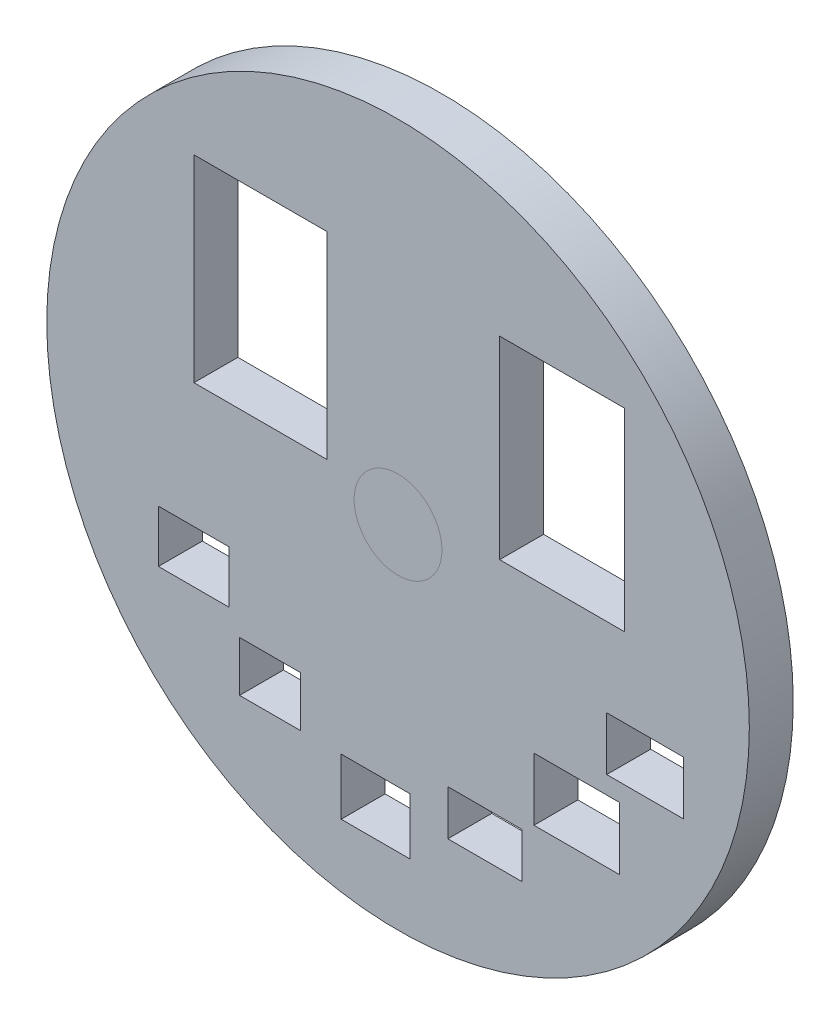
ISO-10303-21;
HEADER;
FILE_DESCRIPTION(('STEP AP214'),'2;1');
FILE_NAME('part.step','',(''),(''),'','','');
FILE_SCHEMA(('AUTOMOTIVE_DESIGN { 1 0 10303 214 1 1 1 1 }'));
ENDSEC;
DATA;
#1=APPLICATION_CONTEXT('core data for automotive mechanical design processes');
#2=APPLICATION_PROTOCOL_DEFINITION('international standard','automotive_design',2000,#1);
#3=PRODUCT_CONTEXT('',#1,'mechanical');
#4=PRODUCT('Part','Part','',(#3));
#5=PRODUCT_RELATED_PRODUCT_CATEGORY('part','',(#4));
#6=PRODUCT_DEFINITION_FORMATION('','',#4);
#7=PRODUCT_DEFINITION_CONTEXT('part definition',#1,'design');
#8=PRODUCT_DEFINITION('design','',#6,#7);
#9=PRODUCT_DEFINITION_SHAPE('','',#8);
#10=(LENGTH_UNIT() NAMED_UNIT(*) SI_UNIT(.MILLI.,.METRE.));
#11=(NAMED_UNIT(*) PLANE_ANGLE_UNIT() SI_UNIT($,.RADIAN.));
#12=(NAMED_UNIT(*) SI_UNIT($,.STERADIAN.) SOLID_ANGLE_UNIT());
#13=UNCERTAINTY_MEASURE_WITH_UNIT(LENGTH_MEASURE(1.E-05),#10,'distance_accuracy_value','');
#14=(GEOMETRIC_REPRESENTATION_CONTEXT(3) GLOBAL_UNCERTAINTY_ASSIGNED_CONTEXT((#13)) GLOBAL_UNIT_ASSIGNED_CONTEXT((#10,
#11,#12)) REPRESENTATION_CONTEXT('',''));
#15=CARTESIAN_POINT('',(0.,0.,0.));
#16=DIRECTION('',(0.,0.,1.));
#17=DIRECTION('',(1.,0.,0.));
#18=AXIS2_PLACEMENT_3D('',#15,#16,#17);
#19=CARTESIAN_POINT('',(0.,0.,6.35));
#20=DIRECTION('',(0.,0.,1.));
#21=DIRECTION('',(1.,0.,0.));
#22=AXIS2_PLACEMENT_3D('',#19,#20,#21);
#23=PLANE('',#22);
#24=CARTESIAN_POINT('',(0.,0.,6.35));
#25=DIRECTION('',(0.,0.,1.));
#26=DIRECTION('',(1.,0.,0.));
#27=AXIS2_PLACEMENT_3D('',#24,#25,#26);
#28=CIRCLE('',#27,50.8);
#29=CARTESIAN_POINT('',(50.8,0.,6.35));
#30=VERTEX_POINT('',#29);
#31=EDGE_CURVE('E55',#30,#30,#28,.T.);
#32=ORIENTED_EDGE('',*,*,#31,.T.);
#33=EDGE_LOOP('',(#32));
#34=FACE_BOUND('',#33,.T.);
#35=DIRECTION('',(0.,-1.,0.));
#36=VECTOR('',#35,1.);
#37=CARTESIAN_POINT('',(-29.511499954496,31.5676290496863,6.35));
#38=LINE('',#37,#36);
#39=CARTESIAN_POINT('',(-29.511499954496,31.5676290496863,6.35));
#40=VERTEX_POINT('',#39);
#41=CARTESIAN_POINT('',(-29.511499954496,3.02371925763281,6.35));
#42=VERTEX_POINT('',#41);
#43=EDGE_CURVE('E381',#40,#42,#38,.T.);
#44=ORIENTED_EDGE('',*,*,#43,.F.);
#45=DIRECTION('',(-1.,0.,0.));
#46=VECTOR('',#45,1.);
#47=CARTESIAN_POINT('',(-29.511499954496,31.5676290496863,6.35));
#48=LINE('',#47,#46);
#49=CARTESIAN_POINT('',(-10.2806454759515,31.5676290496863,6.35));
#50=VERTEX_POINT('',#49);
#51=EDGE_CURVE('E487',#50,#40,#48,.T.);
#52=ORIENTED_EDGE('',*,*,#51,.F.);
#53=DIRECTION('',(0.,1.,0.));
#54=VECTOR('',#53,1.);
#55=CARTESIAN_POINT('',(-10.2806454759515,31.5676290496863,6.35));
#56=LINE('',#55,#54);
#57=CARTESIAN_POINT('',(-10.2806454759515,3.02371925763281,6.35));
#58=VERTEX_POINT('',#57);
#59=EDGE_CURVE('E501',#58,#50,#56,.T.);
#60=ORIENTED_EDGE('',*,*,#59,.F.);
#61=DIRECTION('',(1.,0.,0.));
#62=VECTOR('',#61,1.);
#63=CARTESIAN_POINT('',(-29.511499954496,3.02371925763281,6.35));
#64=LINE('',#63,#62);
#65=EDGE_CURVE('E498',#42,#58,#64,.T.);
#66=ORIENTED_EDGE('',*,*,#65,.F.);
#67=EDGE_LOOP('',(#44,#52,#60,#66));
#68=FACE_BOUND('',#67,.T.);
#69=DIRECTION('',(0.,-1.,0.));
#70=VECTOR('',#69,1.);
#71=CARTESIAN_POINT('',(30.1767181911752,-8.46641392137177,6.35));
#72=LINE('',#71,#70);
#73=CARTESIAN_POINT('',(30.1767181911752,-8.46641392137177,6.35));
#74=VERTEX_POINT('',#73);
#75=CARTESIAN_POINT('',(30.1767181911752,-16.2071352209117,6.35));
#76=VERTEX_POINT('',#75);
#77=EDGE_CURVE('E308',#74,#76,#72,.T.);
#78=ORIENTED_EDGE('',*,*,#77,.F.);
#79=DIRECTION('',(-1.,0.,0.));
#80=VECTOR('',#79,1.);
#81=CARTESIAN_POINT('',(30.1767181911752,-8.46641392137177,6.35));
#82=LINE('',#81,#80);
#83=CARTESIAN_POINT('',(41.3040050592638,-8.46641392137177,6.35));
#84=VERTEX_POINT('',#83);
#85=EDGE_CURVE('E340',#84,#74,#82,.T.);
#86=ORIENTED_EDGE('',*,*,#85,.F.);
#87=DIRECTION('',(0.,1.,0.));
#88=VECTOR('',#87,1.);
#89=CARTESIAN_POINT('',(41.3040050592638,-8.46641392137177,6.35));
#90=LINE('',#89,#88);
#91=CARTESIAN_POINT('',(41.3040050592638,-16.2071352209117,6.35));
#92=VERTEX_POINT('',#91);
#93=EDGE_CURVE('E343',#92,#84,#90,.T.);
#94=ORIENTED_EDGE('',*,*,#93,.F.);
#95=DIRECTION('',(1.,0.,0.));
#96=VECTOR('',#95,1.);
#97=CARTESIAN_POINT('',(30.1767181911752,-16.2071352209117,6.35));
#98=LINE('',#97,#96);
#99=EDGE_CURVE('E347',#76,#92,#98,.T.);
#100=ORIENTED_EDGE('',*,*,#99,.F.);
#101=EDGE_LOOP('',(#78,#86,#94,#100));
#102=FACE_BOUND('',#101,.T.);
#103=DIRECTION('',(0.,-1.,0.));
#104=VECTOR('',#103,1.);
#105=CARTESIAN_POINT('',(19.6541751746131,-18.7772965898996,6.35));
#106=LINE('',#105,#104);
#107=CARTESIAN_POINT('',(19.6541751746131,-18.7772965898996,6.35));
#108=VERTEX_POINT('',#107);
#109=CARTESIAN_POINT('',(19.6541751746131,-27.8182171702216,6.35));
#110=VERTEX_POINT('',#109);
#111=EDGE_CURVE('E267',#108,#110,#106,.T.);
#112=ORIENTED_EDGE('',*,*,#111,.F.);
#113=DIRECTION('',(-1.,0.,0.));
#114=VECTOR('',#113,1.);
#115=CARTESIAN_POINT('',(19.6541751746131,-18.7772965898996,6.35));
#116=LINE('',#115,#114);
#117=CARTESIAN_POINT('',(31.9909497457549,-18.7772965898996,6.35));
#118=VERTEX_POINT('',#117);
#119=EDGE_CURVE('E309',#118,#108,#116,.T.);
#120=ORIENTED_EDGE('',*,*,#119,.F.);
#121=DIRECTION('',(0.,1.,0.));
#122=VECTOR('',#121,1.);
#123=CARTESIAN_POINT('',(31.9909497457549,-18.7772965898996,6.35));
#124=LINE('',#123,#122);
#125=CARTESIAN_POINT('',(31.9909497457549,-27.8182171702216,6.35));
#126=VERTEX_POINT('',#125);
#127=EDGE_CURVE('E312',#126,#118,#124,.T.);
#128=ORIENTED_EDGE('',*,*,#127,.F.);
#129=DIRECTION('',(1.,0.,0.));
#130=VECTOR('',#129,1.);
#131=CARTESIAN_POINT('',(19.6541751746131,-27.8182171702216,6.35));
#132=LINE('',#131,#130);
#133=EDGE_CURVE('E316',#110,#126,#132,.T.);
#134=ORIENTED_EDGE('',*,*,#133,.F.);
#135=EDGE_LOOP('',(#112,#120,#128,#134));
#136=FACE_BOUND('',#135,.T.);
#137=DIRECTION('',(0.,-1.,0.));
#138=VECTOR('',#137,1.);
#139=CARTESIAN_POINT('',(7.19645183316603,-29.2091280287327,6.35));
#140=LINE('',#139,#138);
#141=CARTESIAN_POINT('',(7.19645183316603,-29.2091280287327,6.35));
#142=VERTEX_POINT('',#141);
#143=CARTESIAN_POINT('',(7.19645183316603,-35.7403616252195,6.35));
#144=VERTEX_POINT('',#143);
#145=EDGE_CURVE('E259',#142,#144,#140,.T.);
#146=ORIENTED_EDGE('',*,*,#145,.F.);
#147=DIRECTION('',(-1.,0.,0.));
#148=VECTOR('',#147,1.);
#149=CARTESIAN_POINT('',(7.19645183316603,-29.2091280287327,6.35));
#150=LINE('',#149,#148);
#151=CARTESIAN_POINT('',(17.9004180051861,-29.2091280287327,6.35));
#152=VERTEX_POINT('',#151);
#153=EDGE_CURVE('E270',#152,#142,#150,.T.);
#154=ORIENTED_EDGE('',*,*,#153,.F.);
#155=DIRECTION('',(0.,1.,0.));
#156=VECTOR('',#155,1.);
#157=CARTESIAN_POINT('',(17.9004180051861,-29.2091280287327,6.35));
#158=LINE('',#157,#156);
#159=CARTESIAN_POINT('',(17.9004180051861,-35.7403616252195,6.35));
#160=VERTEX_POINT('',#159);
#161=EDGE_CURVE('E275',#160,#152,#158,.T.);
#162=ORIENTED_EDGE('',*,*,#161,.F.);
#163=DIRECTION('',(1.,0.,0.));
#164=VECTOR('',#163,1.);
#165=CARTESIAN_POINT('',(7.19645183316603,-35.7403616252195,6.35));
#166=LINE('',#165,#164);
#167=EDGE_CURVE('E280',#144,#160,#166,.T.);
#168=ORIENTED_EDGE('',*,*,#167,.F.);
#169=EDGE_LOOP('',(#146,#154,#162,#168));
#170=FACE_BOUND('',#169,.T.);
#171=DIRECTION('',(0.,-1.,0.));
#172=VECTOR('',#171,1.);
#173=CARTESIAN_POINT('',(-8.22451638076117,-32.837591137892,6.35));
#174=LINE('',#173,#172);
#175=CARTESIAN_POINT('',(-8.22451638076117,-32.837591137892,6.35));
#176=VERTEX_POINT('',#175);
#177=CARTESIAN_POINT('',(-8.22451638076117,-41.0016331335005,6.35));
#178=VERTEX_POINT('',#177);
#179=EDGE_CURVE('E433',#176,#178,#174,.T.);
#180=ORIENTED_EDGE('',*,*,#179,.F.);
#181=DIRECTION('',(-1.,0.,0.));
#182=VECTOR('',#181,1.);
#183=CARTESIAN_POINT('',(-8.22451638076117,-32.837591137892,6.35));
#184=LINE('',#183,#182);
#185=CARTESIAN_POINT('',(1.75375716942701,-32.837591137892,6.35));
#186=VERTEX_POINT('',#185);
#187=EDGE_CURVE('E462',#186,#176,#184,.T.);
#188=ORIENTED_EDGE('',*,*,#187,.F.);
#189=DIRECTION('',(0.,1.,0.));
#190=VECTOR('',#189,1.);
#191=CARTESIAN_POINT('',(1.75375716942701,-32.837591137892,6.35));
#192=LINE('',#191,#190);
#193=CARTESIAN_POINT('',(1.75375716942701,-41.0016331335005,6.35));
#194=VERTEX_POINT('',#193);
#195=EDGE_CURVE('E465',#194,#186,#192,.T.);
#196=ORIENTED_EDGE('',*,*,#195,.F.);
#197=DIRECTION('',(1.,0.,0.));
#198=VECTOR('',#197,1.);
#199=CARTESIAN_POINT('',(-8.22451638076117,-41.0016331335005,6.35));
#200=LINE('',#199,#198);
#201=EDGE_CURVE('E469',#178,#194,#200,.T.);
#202=ORIENTED_EDGE('',*,*,#201,.F.);
#203=EDGE_LOOP('',(#180,#188,#196,#202));
#204=FACE_BOUND('',#203,.T.);
#205=DIRECTION('',(0.,-1.,0.));
#206=VECTOR('',#205,1.);
#207=CARTESIAN_POINT('',(-22.9197919728565,-25.5806649195733,6.35));
#208=LINE('',#207,#206);
#209=CARTESIAN_POINT('',(-22.9197919728565,-25.5806649195733,6.35));
#210=VERTEX_POINT('',#209);
#211=CARTESIAN_POINT('',(-22.9197919728565,-32.837591137892,6.35));
#212=VERTEX_POINT('',#211);
#213=EDGE_CURVE('E401',#210,#212,#208,.T.);
#214=ORIENTED_EDGE('',*,*,#213,.F.);
#215=DIRECTION('',(-1.,0.,0.));
#216=VECTOR('',#215,1.);
#217=CARTESIAN_POINT('',(-22.9197919728565,-25.5806649195733,6.35));
#218=LINE('',#217,#216);
#219=CARTESIAN_POINT('',(-14.0905317405688,-25.5806649195733,6.35));
#220=VERTEX_POINT('',#219);
#221=EDGE_CURVE('E434',#220,#210,#218,.T.);
#222=ORIENTED_EDGE('',*,*,#221,.F.);
#223=DIRECTION('',(0.,1.,0.));
#224=VECTOR('',#223,1.);
#225=CARTESIAN_POINT('',(-14.0905317405688,-25.5806649195733,6.35));
#226=LINE('',#225,#224);
#227=CARTESIAN_POINT('',(-14.0905317405688,-32.837591137892,6.35));
#228=VERTEX_POINT('',#227);
#229=EDGE_CURVE('E437',#228,#220,#226,.T.);
#230=ORIENTED_EDGE('',*,*,#229,.F.);
#231=DIRECTION('',(1.,0.,0.));
#232=VECTOR('',#231,1.);
#233=CARTESIAN_POINT('',(-22.9197919728565,-32.837591137892,6.35));
#234=LINE('',#233,#232);
#235=EDGE_CURVE('E441',#212,#228,#234,.T.);
#236=ORIENTED_EDGE('',*,*,#235,.F.);
#237=EDGE_LOOP('',(#214,#222,#230,#236));
#238=FACE_BOUND('',#237,.T.);
#239=DIRECTION('',(0.,-1.,0.));
#240=VECTOR('',#239,1.);
#241=CARTESIAN_POINT('',(-34.6518226924717,-14.9976475178586,6.35));
#242=LINE('',#241,#240);
#243=CARTESIAN_POINT('',(-34.6518226924717,-14.9976475178586,6.35));
#244=VERTEX_POINT('',#243);
#245=CARTESIAN_POINT('',(-34.6518226924717,-22.5569456619405,6.35));
#246=VERTEX_POINT('',#245);
#247=EDGE_CURVE('E70',#244,#246,#242,.T.);
#248=ORIENTED_EDGE('',*,*,#247,.F.);
#249=DIRECTION('',(-1.,0.,0.));
#250=VECTOR('',#249,1.);
#251=CARTESIAN_POINT('',(-34.6518226924717,-14.9976475178586,6.35));
#252=LINE('',#251,#250);
#253=CARTESIAN_POINT('',(-24.4316516016729,-14.9976475178586,6.35));
#254=VERTEX_POINT('',#253);
#255=EDGE_CURVE('E402',#254,#244,#252,.T.);
#256=ORIENTED_EDGE('',*,*,#255,.F.);
#257=DIRECTION('',(0.,1.,0.));
#258=VECTOR('',#257,1.);
#259=CARTESIAN_POINT('',(-24.4316516016729,-14.9976475178586,6.35));
#260=LINE('',#259,#258);
#261=CARTESIAN_POINT('',(-24.4316516016729,-22.5569456619405,6.35));
#262=VERTEX_POINT('',#261);
#263=EDGE_CURVE('E405',#262,#254,#260,.T.);
#264=ORIENTED_EDGE('',*,*,#263,.F.);
#265=DIRECTION('',(1.,0.,0.));
#266=VECTOR('',#265,1.);
#267=CARTESIAN_POINT('',(-34.6518226924717,-22.5569456619405,6.35));
#268=LINE('',#267,#266);
#269=EDGE_CURVE('E409',#246,#262,#268,.T.);
#270=ORIENTED_EDGE('',*,*,#269,.F.);
#271=EDGE_LOOP('',(#248,#256,#264,#270));
#272=FACE_BOUND('',#271,.T.);
#273=DIRECTION('',(0.,-1.,0.));
#274=VECTOR('',#273,1.);
#275=CARTESIAN_POINT('',(14.6952755920953,30.9628851981597,6.35));
#276=LINE('',#275,#274);
#277=CARTESIAN_POINT('',(14.6952755920953,30.9628851981597,6.35));
#278=VERTEX_POINT('',#277);
#279=CARTESIAN_POINT('',(14.6952755920953,2.96324487248015,6.35));
#280=VERTEX_POINT('',#279);
#281=EDGE_CURVE('E62',#278,#280,#276,.T.);
#282=ORIENTED_EDGE('',*,*,#281,.F.);
#283=DIRECTION('',(-1.,0.,0.));
#284=VECTOR('',#283,1.);
#285=CARTESIAN_POINT('',(14.6952755920953,30.9628851981597,6.35));
#286=LINE('',#285,#284);
#287=CARTESIAN_POINT('',(32.7771167527394,30.9628851981597,6.35));
#288=VERTEX_POINT('',#287);
#289=EDGE_CURVE('E370',#288,#278,#286,.T.);
#290=ORIENTED_EDGE('',*,*,#289,.F.);
#291=DIRECTION('',(0.,1.,0.));
#292=VECTOR('',#291,1.);
#293=CARTESIAN_POINT('',(32.7771167527394,30.9628851981597,6.35));
#294=LINE('',#293,#292);
#295=CARTESIAN_POINT('',(32.7771167527394,2.96324487248015,6.35));
#296=VERTEX_POINT('',#295);
#297=EDGE_CURVE('E373',#296,#288,#294,.T.);
#298=ORIENTED_EDGE('',*,*,#297,.F.);
#299=DIRECTION('',(1.,0.,0.));
#300=VECTOR('',#299,1.);
#301=CARTESIAN_POINT('',(14.6952755920953,2.96324487248015,6.35));
#302=LINE('',#301,#300);
#303=EDGE_CURVE('E377',#280,#296,#302,.T.);
#304=ORIENTED_EDGE('',*,*,#303,.F.);
#305=EDGE_LOOP('',(#282,#290,#298,#304));
#306=FACE_BOUND('',#305,.T.);
#307=CARTESIAN_POINT('',(0.,0.,6.35));
#308=DIRECTION('',(0.,0.,1.));
#309=DIRECTION('',(1.,0.,0.));
#310=AXIS2_PLACEMENT_3D('',#307,#308,#309);
#311=CIRCLE('',#310,6.35);
#312=CARTESIAN_POINT('',(6.35,0.,6.35));
#313=VERTEX_POINT('',#312);
#314=EDGE_CURVE('E11',#313,#313,#311,.F.);
#315=ORIENTED_EDGE('',*,*,#314,.T.);
#316=EDGE_LOOP('',(#315));
#317=FACE_BOUND('',#316,.T.);
#318=ADVANCED_FACE('F46',(#34,#68,#102,#136,#170,#204,#238,#272,#306,#317),#23,.T.);
#319=CARTESIAN_POINT('',(0.,0.,6.35));
#320=DIRECTION('',(0.,0.,-1.));
#321=DIRECTION('',(-1.,0.,0.));
#322=AXIS2_PLACEMENT_3D('',#319,#320,#321);
#323=CYLINDRICAL_SURFACE('',#322,50.8);
#324=ORIENTED_EDGE('',*,*,#31,.F.);
#325=EDGE_LOOP('',(#324));
#326=FACE_BOUND('',#325,.T.);
#327=CARTESIAN_POINT('',(0.,0.,0.));
#328=DIRECTION('',(0.,0.,1.));
#329=DIRECTION('',(1.,0.,0.));
#330=AXIS2_PLACEMENT_3D('',#327,#328,#329);
#331=CIRCLE('',#330,50.8);
#332=CARTESIAN_POINT('',(50.8,0.,0.));
#333=VERTEX_POINT('',#332);
#334=EDGE_CURVE('E508',#333,#333,#331,.T.);
#335=ORIENTED_EDGE('',*,*,#334,.T.);
#336=EDGE_LOOP('',(#335));
#337=FACE_BOUND('',#336,.T.);
#338=ADVANCED_FACE('F48',(#326,#337),#323,.T.);
#339=ORIENTED_EDGE('',*,*,#314,.F.);
#340=EDGE_LOOP('',(#339));
#341=FACE_BOUND('',#340,.T.);
#342=ADVANCED_FACE('F523',(#341),#23,.T.);
#343=CARTESIAN_POINT('',(0.,0.,0.));
#344=DIRECTION('',(0.,0.,1.));
#345=DIRECTION('',(1.,0.,0.));
#346=AXIS2_PLACEMENT_3D('',#343,#344,#345);
#347=PLANE('',#346);
#348=DIRECTION('',(-1.,0.,0.));
#349=VECTOR('',#348,1.);
#350=CARTESIAN_POINT('',(14.6952755920953,30.9628851981597,0.));
#351=LINE('',#350,#349);
#352=CARTESIAN_POINT('',(32.7771167527394,30.9628851981597,0.));
#353=VERTEX_POINT('',#352);
#354=CARTESIAN_POINT('',(14.6952755920953,30.9628851981597,0.));
#355=VERTEX_POINT('',#354);
#356=EDGE_CURVE('E363',#353,#355,#351,.T.);
#357=ORIENTED_EDGE('',*,*,#356,.T.);
#358=DIRECTION('',(0.,-1.,0.));
#359=VECTOR('',#358,1.);
#360=CARTESIAN_POINT('',(14.6952755920953,30.9628851981597,0.));
#361=LINE('',#360,#359);
#362=CARTESIAN_POINT('',(14.6952755920953,2.96324487248015,0.));
#363=VERTEX_POINT('',#362);
#364=EDGE_CURVE('E374',#355,#363,#361,.T.);
#365=ORIENTED_EDGE('',*,*,#364,.T.);
#366=DIRECTION('',(1.,0.,0.));
#367=VECTOR('',#366,1.);
#368=CARTESIAN_POINT('',(14.6952755920953,2.96324487248015,0.));
#369=LINE('',#368,#367);
#370=CARTESIAN_POINT('',(32.7771167527394,2.96324487248015,0.));
#371=VERTEX_POINT('',#370);
#372=EDGE_CURVE('E387',#363,#371,#369,.T.);
#373=ORIENTED_EDGE('',*,*,#372,.T.);
#374=DIRECTION('',(0.,1.,0.));
#375=VECTOR('',#374,1.);
#376=CARTESIAN_POINT('',(32.7771167527394,30.9628851981597,0.));
#377=LINE('',#376,#375);
#378=EDGE_CURVE('E384',#371,#353,#377,.T.);
#379=ORIENTED_EDGE('',*,*,#378,.T.);
#380=EDGE_LOOP('',(#357,#365,#373,#379));
#381=FACE_BOUND('',#380,.T.);
#382=DIRECTION('',(-1.,0.,0.));
#383=VECTOR('',#382,1.);
#384=CARTESIAN_POINT('',(-34.6518226924717,-14.9976475178586,0.));
#385=LINE('',#384,#383);
#386=CARTESIAN_POINT('',(-24.4316516016729,-14.9976475178586,0.));
#387=VERTEX_POINT('',#386);
#388=CARTESIAN_POINT('',(-34.6518226924717,-14.9976475178586,0.));
#389=VERTEX_POINT('',#388);
#390=EDGE_CURVE('E394',#387,#389,#385,.T.);
#391=ORIENTED_EDGE('',*,*,#390,.T.);
#392=DIRECTION('',(0.,-1.,0.));
#393=VECTOR('',#392,1.);
#394=CARTESIAN_POINT('',(-34.6518226924717,-14.9976475178586,0.));
#395=LINE('',#394,#393);
#396=CARTESIAN_POINT('',(-34.6518226924717,-22.5569456619405,0.));
#397=VERTEX_POINT('',#396);
#398=EDGE_CURVE('E406',#389,#397,#395,.T.);
#399=ORIENTED_EDGE('',*,*,#398,.T.);
#400=DIRECTION('',(1.,0.,0.));
#401=VECTOR('',#400,1.);
#402=CARTESIAN_POINT('',(-34.6518226924717,-22.5569456619405,0.));
#403=LINE('',#402,#401);
#404=CARTESIAN_POINT('',(-24.4316516016729,-22.5569456619405,0.));
#405=VERTEX_POINT('',#404);
#406=EDGE_CURVE('E418',#397,#405,#403,.T.);
#407=ORIENTED_EDGE('',*,*,#406,.T.);
#408=DIRECTION('',(0.,1.,0.));
#409=VECTOR('',#408,1.);
#410=CARTESIAN_POINT('',(-24.4316516016729,-14.9976475178586,0.));
#411=LINE('',#410,#409);
#412=EDGE_CURVE('E415',#405,#387,#411,.T.);
#413=ORIENTED_EDGE('',*,*,#412,.T.);
#414=EDGE_LOOP('',(#391,#399,#407,#413));
#415=FACE_BOUND('',#414,.T.);
#416=DIRECTION('',(-1.,0.,0.));
#417=VECTOR('',#416,1.);
#418=CARTESIAN_POINT('',(-22.9197919728565,-25.5806649195733,0.));
#419=LINE('',#418,#417);
#420=CARTESIAN_POINT('',(-14.0905317405688,-25.5806649195733,0.));
#421=VERTEX_POINT('',#420);
#422=CARTESIAN_POINT('',(-22.9197919728565,-25.5806649195733,0.));
#423=VERTEX_POINT('',#422);
#424=EDGE_CURVE('E426',#421,#423,#419,.T.);
#425=ORIENTED_EDGE('',*,*,#424,.T.);
#426=DIRECTION('',(0.,-1.,0.));
#427=VECTOR('',#426,1.);
#428=CARTESIAN_POINT('',(-22.9197919728565,-25.5806649195733,0.));
#429=LINE('',#428,#427);
#430=CARTESIAN_POINT('',(-22.9197919728565,-32.837591137892,0.));
#431=VERTEX_POINT('',#430);
#432=EDGE_CURVE('E438',#423,#431,#429,.T.);
#433=ORIENTED_EDGE('',*,*,#432,.T.);
#434=DIRECTION('',(1.,0.,0.));
#435=VECTOR('',#434,1.);
#436=CARTESIAN_POINT('',(-22.9197919728565,-32.837591137892,0.));
#437=LINE('',#436,#435);
#438=CARTESIAN_POINT('',(-14.0905317405688,-32.837591137892,0.));
#439=VERTEX_POINT('',#438);
#440=EDGE_CURVE('E450',#431,#439,#437,.T.);
#441=ORIENTED_EDGE('',*,*,#440,.T.);
#442=DIRECTION('',(0.,1.,0.));
#443=VECTOR('',#442,1.);
#444=CARTESIAN_POINT('',(-14.0905317405688,-25.5806649195733,0.));
#445=LINE('',#444,#443);
#446=EDGE_CURVE('E447',#439,#421,#445,.T.);
#447=ORIENTED_EDGE('',*,*,#446,.T.);
#448=EDGE_LOOP('',(#425,#433,#441,#447));
#449=FACE_BOUND('',#448,.T.);
#450=DIRECTION('',(-1.,0.,0.));
#451=VECTOR('',#450,1.);
#452=CARTESIAN_POINT('',(-8.22451638076117,-32.837591137892,0.));
#453=LINE('',#452,#451);
#454=CARTESIAN_POINT('',(1.75375716942701,-32.837591137892,0.));
#455=VERTEX_POINT('',#454);
#456=CARTESIAN_POINT('',(-8.22451638076117,-32.837591137892,0.));
#457=VERTEX_POINT('',#456);
#458=EDGE_CURVE('E458',#455,#457,#453,.T.);
#459=ORIENTED_EDGE('',*,*,#458,.T.);
#460=DIRECTION('',(0.,-1.,0.));
#461=VECTOR('',#460,1.);
#462=CARTESIAN_POINT('',(-8.22451638076117,-32.837591137892,0.));
#463=LINE('',#462,#461);
#464=CARTESIAN_POINT('',(-8.22451638076117,-41.0016331335005,0.));
#465=VERTEX_POINT('',#464);
#466=EDGE_CURVE('E466',#457,#465,#463,.T.);
#467=ORIENTED_EDGE('',*,*,#466,.T.);
#468=DIRECTION('',(1.,0.,0.));
#469=VECTOR('',#468,1.);
#470=CARTESIAN_POINT('',(-8.22451638076117,-41.0016331335005,0.));
#471=LINE('',#470,#469);
#472=CARTESIAN_POINT('',(1.75375716942701,-41.0016331335005,0.));
#473=VERTEX_POINT('',#472);
#474=EDGE_CURVE('E478',#465,#473,#471,.T.);
#475=ORIENTED_EDGE('',*,*,#474,.T.);
#476=DIRECTION('',(0.,1.,0.));
#477=VECTOR('',#476,1.);
#478=CARTESIAN_POINT('',(1.75375716942701,-32.837591137892,0.));
#479=LINE('',#478,#477);
#480=EDGE_CURVE('E475',#473,#455,#479,.T.);
#481=ORIENTED_EDGE('',*,*,#480,.T.);
#482=EDGE_LOOP('',(#459,#467,#475,#481));
#483=FACE_BOUND('',#482,.T.);
#484=DIRECTION('',(-1.,0.,0.));
#485=VECTOR('',#484,1.);
#486=CARTESIAN_POINT('',(7.19645183316603,-29.2091280287327,0.));
#487=LINE('',#486,#485);
#488=CARTESIAN_POINT('',(17.9004180051861,-29.2091280287327,0.));
#489=VERTEX_POINT('',#488);
#490=CARTESIAN_POINT('',(7.19645183316603,-29.2091280287327,0.));
#491=VERTEX_POINT('',#490);
#492=EDGE_CURVE('E288',#489,#491,#487,.T.);
#493=ORIENTED_EDGE('',*,*,#492,.T.);
#494=DIRECTION('',(0.,-1.,0.));
#495=VECTOR('',#494,1.);
#496=CARTESIAN_POINT('',(7.19645183316603,-29.2091280287327,0.));
#497=LINE('',#496,#495);
#498=CARTESIAN_POINT('',(7.19645183316603,-35.7403616252195,0.));
#499=VERTEX_POINT('',#498);
#500=EDGE_CURVE('E262',#491,#499,#497,.T.);
#501=ORIENTED_EDGE('',*,*,#500,.T.);
#502=DIRECTION('',(1.,0.,0.));
#503=VECTOR('',#502,1.);
#504=CARTESIAN_POINT('',(7.19645183316603,-35.7403616252195,0.));
#505=LINE('',#504,#503);
#506=CARTESIAN_POINT('',(17.9004180051861,-35.7403616252195,0.));
#507=VERTEX_POINT('',#506);
#508=EDGE_CURVE('E294',#499,#507,#505,.T.);
#509=ORIENTED_EDGE('',*,*,#508,.T.);
#510=DIRECTION('',(0.,1.,0.));
#511=VECTOR('',#510,1.);
#512=CARTESIAN_POINT('',(17.9004180051861,-29.2091280287327,0.));
#513=LINE('',#512,#511);
#514=EDGE_CURVE('E290',#507,#489,#513,.T.);
#515=ORIENTED_EDGE('',*,*,#514,.T.);
#516=EDGE_LOOP('',(#493,#501,#509,#515));
#517=FACE_BOUND('',#516,.T.);
#518=DIRECTION('',(-1.,0.,0.));
#519=VECTOR('',#518,1.);
#520=CARTESIAN_POINT('',(19.6541751746131,-18.7772965898996,0.));
#521=LINE('',#520,#519);
#522=CARTESIAN_POINT('',(31.9909497457549,-18.7772965898996,0.));
#523=VERTEX_POINT('',#522);
#524=CARTESIAN_POINT('',(19.6541751746131,-18.7772965898996,0.));
#525=VERTEX_POINT('',#524);
#526=EDGE_CURVE('E301',#523,#525,#521,.T.);
#527=ORIENTED_EDGE('',*,*,#526,.T.);
#528=DIRECTION('',(0.,-1.,0.));
#529=VECTOR('',#528,1.);
#530=CARTESIAN_POINT('',(19.6541751746131,-18.7772965898996,0.));
#531=LINE('',#530,#529);
#532=CARTESIAN_POINT('',(19.6541751746131,-27.8182171702216,0.));
#533=VERTEX_POINT('',#532);
#534=EDGE_CURVE('E313',#525,#533,#531,.T.);
#535=ORIENTED_EDGE('',*,*,#534,.T.);
#536=DIRECTION('',(1.,0.,0.));
#537=VECTOR('',#536,1.);
#538=CARTESIAN_POINT('',(19.6541751746131,-27.8182171702216,0.));
#539=LINE('',#538,#537);
#540=CARTESIAN_POINT('',(31.9909497457549,-27.8182171702216,0.));
#541=VERTEX_POINT('',#540);
#542=EDGE_CURVE('E325',#533,#541,#539,.T.);
#543=ORIENTED_EDGE('',*,*,#542,.T.);
#544=DIRECTION('',(0.,1.,0.));
#545=VECTOR('',#544,1.);
#546=CARTESIAN_POINT('',(31.9909497457549,-18.7772965898996,0.));
#547=LINE('',#546,#545);
#548=EDGE_CURVE('E322',#541,#523,#547,.T.);
#549=ORIENTED_EDGE('',*,*,#548,.T.);
#550=EDGE_LOOP('',(#527,#535,#543,#549));
#551=FACE_BOUND('',#550,.T.);
#552=DIRECTION('',(-1.,0.,0.));
#553=VECTOR('',#552,1.);
#554=CARTESIAN_POINT('',(30.1767181911752,-8.46641392137177,0.));
#555=LINE('',#554,#553);
#556=CARTESIAN_POINT('',(41.3040050592638,-8.46641392137177,0.));
#557=VERTEX_POINT('',#556);
#558=CARTESIAN_POINT('',(30.1767181911752,-8.46641392137177,0.));
#559=VERTEX_POINT('',#558);
#560=EDGE_CURVE('E333',#557,#559,#555,.T.);
#561=ORIENTED_EDGE('',*,*,#560,.T.);
#562=DIRECTION('',(0.,-1.,0.));
#563=VECTOR('',#562,1.);
#564=CARTESIAN_POINT('',(30.1767181911752,-8.46641392137177,0.));
#565=LINE('',#564,#563);
#566=CARTESIAN_POINT('',(30.1767181911752,-16.2071352209117,0.));
#567=VERTEX_POINT('',#566);
#568=EDGE_CURVE('E344',#559,#567,#565,.T.);
#569=ORIENTED_EDGE('',*,*,#568,.T.);
#570=DIRECTION('',(1.,0.,0.));
#571=VECTOR('',#570,1.);
#572=CARTESIAN_POINT('',(30.1767181911752,-16.2071352209117,0.));
#573=LINE('',#572,#571);
#574=CARTESIAN_POINT('',(41.3040050592638,-16.2071352209117,0.));
#575=VERTEX_POINT('',#574);
#576=EDGE_CURVE('E356',#567,#575,#573,.T.);
#577=ORIENTED_EDGE('',*,*,#576,.T.);
#578=DIRECTION('',(0.,1.,0.));
#579=VECTOR('',#578,1.);
#580=CARTESIAN_POINT('',(41.3040050592638,-8.46641392137177,0.));
#581=LINE('',#580,#579);
#582=EDGE_CURVE('E353',#575,#557,#581,.T.);
#583=ORIENTED_EDGE('',*,*,#582,.T.);
#584=EDGE_LOOP('',(#561,#569,#577,#583));
#585=FACE_BOUND('',#584,.T.);
#586=DIRECTION('',(-1.,0.,0.));
#587=VECTOR('',#586,1.);
#588=CARTESIAN_POINT('',(-29.511499954496,31.5676290496863,0.));
#589=LINE('',#588,#587);
#590=CARTESIAN_POINT('',(-10.2806454759515,31.5676290496863,0.));
#591=VERTEX_POINT('',#590);
#592=CARTESIAN_POINT('',(-29.511499954496,31.5676290496863,0.));
#593=VERTEX_POINT('',#592);
#594=EDGE_CURVE('E493',#591,#593,#589,.T.);
#595=ORIENTED_EDGE('',*,*,#594,.T.);
#596=DIRECTION('',(0.,-1.,0.));
#597=VECTOR('',#596,1.);
#598=CARTESIAN_POINT('',(-29.511499954496,31.5676290496863,0.));
#599=LINE('',#598,#597);
#600=CARTESIAN_POINT('',(-29.511499954496,3.02371925763281,0.));
#601=VERTEX_POINT('',#600);
#602=EDGE_CURVE('E483',#593,#601,#599,.T.);
#603=ORIENTED_EDGE('',*,*,#602,.T.);
#604=DIRECTION('',(1.,0.,0.));
#605=VECTOR('',#604,1.);
#606=CARTESIAN_POINT('',(-29.511499954496,3.02371925763281,0.));
#607=LINE('',#606,#605);
#608=CARTESIAN_POINT('',(-10.2806454759515,3.02371925763281,0.));
#609=VERTEX_POINT('',#608);
#610=EDGE_CURVE('E486',#601,#609,#607,.T.);
#611=ORIENTED_EDGE('',*,*,#610,.T.);
#612=DIRECTION('',(0.,1.,0.));
#613=VECTOR('',#612,1.);
#614=CARTESIAN_POINT('',(-10.2806454759515,31.5676290496863,0.));
#615=LINE('',#614,#613);
#616=EDGE_CURVE('E490',#609,#591,#615,.T.);
#617=ORIENTED_EDGE('',*,*,#616,.T.);
#618=EDGE_LOOP('',(#595,#603,#611,#617));
#619=FACE_BOUND('',#618,.T.);
#620=ORIENTED_EDGE('',*,*,#334,.F.);
#621=EDGE_LOOP('',(#620));
#622=FACE_BOUND('',#621,.T.);
#623=ADVANCED_FACE('F520',(#381,#415,#449,#483,#517,#551,#585,#619,#622),#347,.F.);
#624=CARTESIAN_POINT('',(-29.511499954496,31.5676290496863,0.));
#625=DIRECTION('',(-1.,0.,0.));
#626=DIRECTION('',(0.,-1.,0.));
#627=AXIS2_PLACEMENT_3D('',#624,#625,#626);
#628=PLANE('',#627);
#629=ORIENTED_EDGE('',*,*,#43,.T.);
#630=DIRECTION('',(0.,0.,1.));
#631=VECTOR('',#630,1.);
#632=CARTESIAN_POINT('',(-29.511499954496,3.02371925763281,0.));
#633=LINE('',#632,#631);
#634=EDGE_CURVE('E496',#601,#42,#633,.T.);
#635=ORIENTED_EDGE('',*,*,#634,.F.);
#636=ORIENTED_EDGE('',*,*,#602,.F.);
#637=DIRECTION('',(0.,0.,1.));
#638=VECTOR('',#637,1.);
#639=CARTESIAN_POINT('',(-29.511499954496,31.5676290496863,0.));
#640=LINE('',#639,#638);
#641=EDGE_CURVE('E506',#593,#40,#640,.T.);
#642=ORIENTED_EDGE('',*,*,#641,.T.);
#643=EDGE_LOOP('',(#629,#635,#636,#642));
#644=FACE_BOUND('',#643,.T.);
#645=ADVANCED_FACE('F522',(#644),#628,.F.);
#646=CARTESIAN_POINT('',(-29.511499954496,31.5676290496863,0.));
#647=DIRECTION('',(0.,1.,0.));
#648=DIRECTION('',(0.,0.,1.));
#649=AXIS2_PLACEMENT_3D('',#646,#647,#648);
#650=PLANE('',#649);
#651=ORIENTED_EDGE('',*,*,#51,.T.);
#652=ORIENTED_EDGE('',*,*,#641,.F.);
#653=ORIENTED_EDGE('',*,*,#594,.F.);
#654=DIRECTION('',(0.,0.,1.));
#655=VECTOR('',#654,1.);
#656=CARTESIAN_POINT('',(-10.2806454759515,31.5676290496863,0.));
#657=LINE('',#656,#655);
#658=EDGE_CURVE('E509',#591,#50,#657,.T.);
#659=ORIENTED_EDGE('',*,*,#658,.T.);
#660=EDGE_LOOP('',(#651,#652,#653,#659));
#661=FACE_BOUND('',#660,.T.);
#662=ADVANCED_FACE('F529',(#661),#650,.F.);
#663=CARTESIAN_POINT('',(-10.2806454759515,31.5676290496863,0.));
#664=DIRECTION('',(1.,0.,0.));
#665=DIRECTION('',(0.,1.,0.));
#666=AXIS2_PLACEMENT_3D('',#663,#664,#665);
#667=PLANE('',#666);
#668=ORIENTED_EDGE('',*,*,#59,.T.);
#669=ORIENTED_EDGE('',*,*,#658,.F.);
#670=ORIENTED_EDGE('',*,*,#616,.F.);
#671=DIRECTION('',(0.,0.,1.));
#672=VECTOR('',#671,1.);
#673=CARTESIAN_POINT('',(-10.2806454759515,3.02371925763281,0.));
#674=LINE('',#673,#672);
#675=EDGE_CURVE('E511',#609,#58,#674,.T.);
#676=ORIENTED_EDGE('',*,*,#675,.T.);
#677=EDGE_LOOP('',(#668,#669,#670,#676));
#678=FACE_BOUND('',#677,.T.);
#679=ADVANCED_FACE('F548',(#678),#667,.F.);
#680=CARTESIAN_POINT('',(-29.511499954496,3.02371925763281,0.));
#681=DIRECTION('',(0.,-1.,0.));
#682=DIRECTION('',(0.,0.,-1.));
#683=AXIS2_PLACEMENT_3D('',#680,#681,#682);
#684=PLANE('',#683);
#685=ORIENTED_EDGE('',*,*,#65,.T.);
#686=ORIENTED_EDGE('',*,*,#675,.F.);
#687=ORIENTED_EDGE('',*,*,#610,.F.);
#688=ORIENTED_EDGE('',*,*,#634,.T.);
#689=EDGE_LOOP('',(#685,#686,#687,#688));
#690=FACE_BOUND('',#689,.T.);
#691=ADVANCED_FACE('F544',(#690),#684,.F.);
#692=CARTESIAN_POINT('',(30.1767181911752,-8.46641392137177,0.));
#693=DIRECTION('',(-1.,0.,0.));
#694=DIRECTION('',(0.,0.,1.));
#695=AXIS2_PLACEMENT_3D('',#692,#693,#694);
#696=PLANE('',#695);
#697=ORIENTED_EDGE('',*,*,#77,.T.);
#698=DIRECTION('',(0.,0.,1.));
#699=VECTOR('',#698,1.);
#700=CARTESIAN_POINT('',(30.1767181911752,-16.2071352209117,0.));
#701=LINE('',#700,#699);
#702=EDGE_CURVE('E330',#567,#76,#701,.T.);
#703=ORIENTED_EDGE('',*,*,#702,.F.);
#704=ORIENTED_EDGE('',*,*,#568,.F.);
#705=DIRECTION('',(0.,0.,1.));
#706=VECTOR('',#705,1.);
#707=CARTESIAN_POINT('',(30.1767181911752,-8.46641392137177,0.));
#708=LINE('',#707,#706);
#709=EDGE_CURVE('E338',#559,#74,#708,.T.);
#710=ORIENTED_EDGE('',*,*,#709,.T.);
#711=EDGE_LOOP('',(#697,#703,#704,#710));
#712=FACE_BOUND('',#711,.T.);
#713=ADVANCED_FACE('F547',(#712),#696,.F.);
#714=CARTESIAN_POINT('',(30.1767181911752,-8.46641392137177,0.));
#715=DIRECTION('',(0.,1.,0.));
#716=DIRECTION('',(0.,0.,1.));
#717=AXIS2_PLACEMENT_3D('',#714,#715,#716);
#718=PLANE('',#717);
#719=ORIENTED_EDGE('',*,*,#85,.T.);
#720=ORIENTED_EDGE('',*,*,#709,.F.);
#721=ORIENTED_EDGE('',*,*,#560,.F.);
#722=DIRECTION('',(0.,0.,1.));
#723=VECTOR('',#722,1.);
#724=CARTESIAN_POINT('',(41.3040050592638,-8.46641392137177,0.));
#725=LINE('',#724,#723);
#726=EDGE_CURVE('E336',#557,#84,#725,.T.);
#727=ORIENTED_EDGE('',*,*,#726,.T.);
#728=EDGE_LOOP('',(#719,#720,#721,#727));
#729=FACE_BOUND('',#728,.T.);
#730=ADVANCED_FACE('F618',(#729),#718,.F.);
#731=CARTESIAN_POINT('',(41.3040050592638,-8.46641392137177,0.));
#732=DIRECTION('',(1.,0.,0.));
#733=DIRECTION('',(0.,0.,-1.));
#734=AXIS2_PLACEMENT_3D('',#731,#732,#733);
#735=PLANE('',#734);
#736=ORIENTED_EDGE('',*,*,#93,.T.);
#737=ORIENTED_EDGE('',*,*,#726,.F.);
#738=ORIENTED_EDGE('',*,*,#582,.F.);
#739=DIRECTION('',(0.,0.,1.));
#740=VECTOR('',#739,1.);
#741=CARTESIAN_POINT('',(41.3040050592638,-16.2071352209117,0.));
#742=LINE('',#741,#740);
#743=EDGE_CURVE('E334',#575,#92,#742,.T.);
#744=ORIENTED_EDGE('',*,*,#743,.T.);
#745=EDGE_LOOP('',(#736,#737,#738,#744));
#746=FACE_BOUND('',#745,.T.);
#747=ADVANCED_FACE('F621',(#746),#735,.F.);
#748=CARTESIAN_POINT('',(30.1767181911752,-16.2071352209117,0.));
#749=DIRECTION('',(0.,-1.,0.));
#750=DIRECTION('',(0.,0.,-1.));
#751=AXIS2_PLACEMENT_3D('',#748,#749,#750);
#752=PLANE('',#751);
#753=ORIENTED_EDGE('',*,*,#99,.T.);
#754=ORIENTED_EDGE('',*,*,#743,.F.);
#755=ORIENTED_EDGE('',*,*,#576,.F.);
#756=ORIENTED_EDGE('',*,*,#702,.T.);
#757=EDGE_LOOP('',(#753,#754,#755,#756));
#758=FACE_BOUND('',#757,.T.);
#759=ADVANCED_FACE('F625',(#758),#752,.F.);
#760=CARTESIAN_POINT('',(19.6541751746131,-18.7772965898996,0.));
#761=DIRECTION('',(-1.,0.,0.));
#762=DIRECTION('',(0.,0.,1.));
#763=AXIS2_PLACEMENT_3D('',#760,#761,#762);
#764=PLANE('',#763);
#765=ORIENTED_EDGE('',*,*,#111,.T.);
#766=DIRECTION('',(0.,0.,1.));
#767=VECTOR('',#766,1.);
#768=CARTESIAN_POINT('',(19.6541751746131,-27.8182171702216,0.));
#769=LINE('',#768,#767);
#770=EDGE_CURVE('E298',#533,#110,#769,.T.);
#771=ORIENTED_EDGE('',*,*,#770,.F.);
#772=ORIENTED_EDGE('',*,*,#534,.F.);
#773=DIRECTION('',(0.,0.,1.));
#774=VECTOR('',#773,1.);
#775=CARTESIAN_POINT('',(19.6541751746131,-18.7772965898996,0.));
#776=LINE('',#775,#774);
#777=EDGE_CURVE('E306',#525,#108,#776,.T.);
#778=ORIENTED_EDGE('',*,*,#777,.T.);
#779=EDGE_LOOP('',(#765,#771,#772,#778));
#780=FACE_BOUND('',#779,.T.);
#781=ADVANCED_FACE('F629',(#780),#764,.F.);
#782=CARTESIAN_POINT('',(19.6541751746131,-18.7772965898996,0.));
#783=DIRECTION('',(0.,1.,0.));
#784=DIRECTION('',(0.,0.,1.));
#785=AXIS2_PLACEMENT_3D('',#782,#783,#784);
#786=PLANE('',#785);
#787=ORIENTED_EDGE('',*,*,#119,.T.);
#788=ORIENTED_EDGE('',*,*,#777,.F.);
#789=ORIENTED_EDGE('',*,*,#526,.F.);
#790=DIRECTION('',(0.,0.,1.));
#791=VECTOR('',#790,1.);
#792=CARTESIAN_POINT('',(31.9909497457549,-18.7772965898996,0.));
#793=LINE('',#792,#791);
#794=EDGE_CURVE('E304',#523,#118,#793,.T.);
#795=ORIENTED_EDGE('',*,*,#794,.T.);
#796=EDGE_LOOP('',(#787,#788,#789,#795));
#797=FACE_BOUND('',#796,.T.);
#798=ADVANCED_FACE('F634',(#797),#786,.F.);
#799=CARTESIAN_POINT('',(31.9909497457549,-18.7772965898996,0.));
#800=DIRECTION('',(1.,0.,0.));
#801=DIRECTION('',(0.,0.,-1.));
#802=AXIS2_PLACEMENT_3D('',#799,#800,#801);
#803=PLANE('',#802);
#804=ORIENTED_EDGE('',*,*,#127,.T.);
#805=ORIENTED_EDGE('',*,*,#794,.F.);
#806=ORIENTED_EDGE('',*,*,#548,.F.);
#807=DIRECTION('',(0.,0.,1.));
#808=VECTOR('',#807,1.);
#809=CARTESIAN_POINT('',(31.9909497457549,-27.8182171702216,0.));
#810=LINE('',#809,#808);
#811=EDGE_CURVE('E302',#541,#126,#810,.T.);
#812=ORIENTED_EDGE('',*,*,#811,.T.);
#813=EDGE_LOOP('',(#804,#805,#806,#812));
#814=FACE_BOUND('',#813,.T.);
#815=ADVANCED_FACE('F637',(#814),#803,.F.);
#816=CARTESIAN_POINT('',(19.6541751746131,-27.8182171702216,0.));
#817=DIRECTION('',(0.,-1.,0.));
#818=DIRECTION('',(0.,0.,-1.));
#819=AXIS2_PLACEMENT_3D('',#816,#817,#818);
#820=PLANE('',#819);
#821=ORIENTED_EDGE('',*,*,#133,.T.);
#822=ORIENTED_EDGE('',*,*,#811,.F.);
#823=ORIENTED_EDGE('',*,*,#542,.F.);
#824=ORIENTED_EDGE('',*,*,#770,.T.);
#825=EDGE_LOOP('',(#821,#822,#823,#824));
#826=FACE_BOUND('',#825,.T.);
#827=ADVANCED_FACE('F641',(#826),#820,.F.);
#828=CARTESIAN_POINT('',(7.19645183316603,-29.2091280287327,0.));
#829=DIRECTION('',(-1.,0.,0.));
#830=DIRECTION('',(0.,0.,1.));
#831=AXIS2_PLACEMENT_3D('',#828,#829,#830);
#832=PLANE('',#831);
#833=ORIENTED_EDGE('',*,*,#145,.T.);
#834=DIRECTION('',(0.,0.,1.));
#835=VECTOR('',#834,1.);
#836=CARTESIAN_POINT('',(7.19645183316603,-35.7403616252195,0.));
#837=LINE('',#836,#835);
#838=EDGE_CURVE('E291',#499,#144,#837,.T.);
#839=ORIENTED_EDGE('',*,*,#838,.F.);
#840=ORIENTED_EDGE('',*,*,#500,.F.);
#841=DIRECTION('',(0.,0.,1.));
#842=VECTOR('',#841,1.);
#843=CARTESIAN_POINT('',(7.19645183316603,-29.2091280287327,0.));
#844=LINE('',#843,#842);
#845=EDGE_CURVE('E255',#491,#142,#844,.T.);
#846=ORIENTED_EDGE('',*,*,#845,.T.);
#847=EDGE_LOOP('',(#833,#839,#840,#846));
#848=FACE_BOUND('',#847,.T.);
#849=ADVANCED_FACE('F257',(#848),#832,.F.);
#850=CARTESIAN_POINT('',(7.19645183316603,-29.2091280287327,0.));
#851=DIRECTION('',(0.,1.,0.));
#852=DIRECTION('',(0.,0.,1.));
#853=AXIS2_PLACEMENT_3D('',#850,#851,#852);
#854=PLANE('',#853);
#855=ORIENTED_EDGE('',*,*,#153,.T.);
#856=ORIENTED_EDGE('',*,*,#845,.F.);
#857=ORIENTED_EDGE('',*,*,#492,.F.);
#858=DIRECTION('',(0.,0.,1.));
#859=VECTOR('',#858,1.);
#860=CARTESIAN_POINT('',(17.9004180051861,-29.2091280287327,0.));
#861=LINE('',#860,#859);
#862=EDGE_CURVE('E266',#489,#152,#861,.T.);
#863=ORIENTED_EDGE('',*,*,#862,.T.);
#864=EDGE_LOOP('',(#855,#856,#857,#863));
#865=FACE_BOUND('',#864,.T.);
#866=ADVANCED_FACE('F271',(#865),#854,.F.);
#867=CARTESIAN_POINT('',(17.9004180051861,-29.2091280287327,0.));
#868=DIRECTION('',(1.,0.,0.));
#869=DIRECTION('',(0.,0.,-1.));
#870=AXIS2_PLACEMENT_3D('',#867,#868,#869);
#871=PLANE('',#870);
#872=ORIENTED_EDGE('',*,*,#161,.T.);
#873=ORIENTED_EDGE('',*,*,#862,.F.);
#874=ORIENTED_EDGE('',*,*,#514,.F.);
#875=DIRECTION('',(0.,0.,1.));
#876=VECTOR('',#875,1.);
#877=CARTESIAN_POINT('',(17.9004180051861,-35.7403616252195,0.));
#878=LINE('',#877,#876);
#879=EDGE_CURVE('E876',#507,#160,#878,.T.);
#880=ORIENTED_EDGE('',*,*,#879,.T.);
#881=EDGE_LOOP('',(#872,#873,#874,#880));
#882=FACE_BOUND('',#881,.T.);
#883=ADVANCED_FACE('F651',(#882),#871,.F.);
#884=CARTESIAN_POINT('',(7.19645183316603,-35.7403616252195,0.));
#885=DIRECTION('',(0.,-1.,0.));
#886=DIRECTION('',(0.,0.,-1.));
#887=AXIS2_PLACEMENT_3D('',#884,#885,#886);
#888=PLANE('',#887);
#889=ORIENTED_EDGE('',*,*,#167,.T.);
#890=ORIENTED_EDGE('',*,*,#879,.F.);
#891=ORIENTED_EDGE('',*,*,#508,.F.);
#892=ORIENTED_EDGE('',*,*,#838,.T.);
#893=EDGE_LOOP('',(#889,#890,#891,#892));
#894=FACE_BOUND('',#893,.T.);
#895=ADVANCED_FACE('F572',(#894),#888,.F.);
#896=CARTESIAN_POINT('',(-8.22451638076117,-32.837591137892,0.));
#897=DIRECTION('',(-1.,0.,0.));
#898=DIRECTION('',(0.,0.,1.));
#899=AXIS2_PLACEMENT_3D('',#896,#897,#898);
#900=PLANE('',#899);
#901=ORIENTED_EDGE('',*,*,#179,.T.);
#902=DIRECTION('',(0.,0.,1.));
#903=VECTOR('',#902,1.);
#904=CARTESIAN_POINT('',(-8.22451638076117,-41.0016331335005,0.));
#905=LINE('',#904,#903);
#906=EDGE_CURVE('E455',#465,#178,#905,.T.);
#907=ORIENTED_EDGE('',*,*,#906,.F.);
#908=ORIENTED_EDGE('',*,*,#466,.F.);
#909=DIRECTION('',(0.,0.,1.));
#910=VECTOR('',#909,1.);
#911=CARTESIAN_POINT('',(-8.22451638076117,-32.837591137892,0.));
#912=LINE('',#911,#910);
#913=EDGE_CURVE('E281',#457,#176,#912,.T.);
#914=ORIENTED_EDGE('',*,*,#913,.T.);
#915=EDGE_LOOP('',(#901,#907,#908,#914));
#916=FACE_BOUND('',#915,.T.);
#917=ADVANCED_FACE('F560',(#916),#900,.F.);
#918=CARTESIAN_POINT('',(-8.22451638076117,-32.837591137892,0.));
#919=DIRECTION('',(0.,1.,0.));
#920=DIRECTION('',(0.,0.,1.));
#921=AXIS2_PLACEMENT_3D('',#918,#919,#920);
#922=PLANE('',#921);
#923=ORIENTED_EDGE('',*,*,#187,.T.);
#924=ORIENTED_EDGE('',*,*,#913,.F.);
#925=ORIENTED_EDGE('',*,*,#458,.F.);
#926=DIRECTION('',(0.,0.,1.));
#927=VECTOR('',#926,1.);
#928=CARTESIAN_POINT('',(1.75375716942701,-32.837591137892,0.));
#929=LINE('',#928,#927);
#930=EDGE_CURVE('E283',#455,#186,#929,.T.);
#931=ORIENTED_EDGE('',*,*,#930,.T.);
#932=EDGE_LOOP('',(#923,#924,#925,#931));
#933=FACE_BOUND('',#932,.T.);
#934=ADVANCED_FACE('F556',(#933),#922,.F.);
#935=CARTESIAN_POINT('',(1.75375716942701,-32.837591137892,0.));
#936=DIRECTION('',(1.,0.,0.));
#937=DIRECTION('',(0.,0.,-1.));
#938=AXIS2_PLACEMENT_3D('',#935,#936,#937);
#939=PLANE('',#938);
#940=ORIENTED_EDGE('',*,*,#195,.T.);
#941=ORIENTED_EDGE('',*,*,#930,.F.);
#942=ORIENTED_EDGE('',*,*,#480,.F.);
#943=DIRECTION('',(0.,0.,1.));
#944=VECTOR('',#943,1.);
#945=CARTESIAN_POINT('',(1.75375716942701,-41.0016331335005,0.));
#946=LINE('',#945,#944);
#947=EDGE_CURVE('E459',#473,#194,#946,.T.);
#948=ORIENTED_EDGE('',*,*,#947,.T.);
#949=EDGE_LOOP('',(#940,#941,#942,#948));
#950=FACE_BOUND('',#949,.T.);
#951=ADVANCED_FACE('F559',(#950),#939,.F.);
#952=CARTESIAN_POINT('',(-8.22451638076117,-41.0016331335005,0.));
#953=DIRECTION('',(0.,-1.,0.));
#954=DIRECTION('',(0.,0.,-1.));
#955=AXIS2_PLACEMENT_3D('',#952,#953,#954);
#956=PLANE('',#955);
#957=ORIENTED_EDGE('',*,*,#201,.T.);
#958=ORIENTED_EDGE('',*,*,#947,.F.);
#959=ORIENTED_EDGE('',*,*,#474,.F.);
#960=ORIENTED_EDGE('',*,*,#906,.T.);
#961=EDGE_LOOP('',(#957,#958,#959,#960));
#962=FACE_BOUND('',#961,.T.);
#963=ADVANCED_FACE('F564',(#962),#956,.F.);
#964=CARTESIAN_POINT('',(-22.9197919728565,-25.5806649195733,0.));
#965=DIRECTION('',(-1.,0.,0.));
#966=DIRECTION('',(0.,0.,1.));
#967=AXIS2_PLACEMENT_3D('',#964,#965,#966);
#968=PLANE('',#967);
#969=ORIENTED_EDGE('',*,*,#213,.T.);
#970=DIRECTION('',(0.,0.,1.));
#971=VECTOR('',#970,1.);
#972=CARTESIAN_POINT('',(-22.9197919728565,-32.837591137892,0.));
#973=LINE('',#972,#971);
#974=EDGE_CURVE('E423',#431,#212,#973,.T.);
#975=ORIENTED_EDGE('',*,*,#974,.F.);
#976=ORIENTED_EDGE('',*,*,#432,.F.);
#977=DIRECTION('',(0.,0.,1.));
#978=VECTOR('',#977,1.);
#979=CARTESIAN_POINT('',(-22.9197919728565,-25.5806649195733,0.));
#980=LINE('',#979,#978);
#981=EDGE_CURVE('E431',#423,#210,#980,.T.);
#982=ORIENTED_EDGE('',*,*,#981,.T.);
#983=EDGE_LOOP('',(#969,#975,#976,#982));
#984=FACE_BOUND('',#983,.T.);
#985=ADVANCED_FACE('F568',(#984),#968,.F.);
#986=CARTESIAN_POINT('',(-22.9197919728565,-25.5806649195733,0.));
#987=DIRECTION('',(0.,1.,0.));
#988=DIRECTION('',(0.,0.,1.));
#989=AXIS2_PLACEMENT_3D('',#986,#987,#988);
#990=PLANE('',#989);
#991=ORIENTED_EDGE('',*,*,#221,.T.);
#992=ORIENTED_EDGE('',*,*,#981,.F.);
#993=ORIENTED_EDGE('',*,*,#424,.F.);
#994=DIRECTION('',(0.,0.,1.));
#995=VECTOR('',#994,1.);
#996=CARTESIAN_POINT('',(-14.0905317405688,-25.5806649195733,0.));
#997=LINE('',#996,#995);
#998=EDGE_CURVE('E429',#421,#220,#997,.T.);
#999=ORIENTED_EDGE('',*,*,#998,.T.);
#1000=EDGE_LOOP('',(#991,#992,#993,#999));
#1001=FACE_BOUND('',#1000,.T.);
#1002=ADVANCED_FACE('F574',(#1001),#990,.F.);
#1003=CARTESIAN_POINT('',(-14.0905317405688,-25.5806649195733,0.));
#1004=DIRECTION('',(1.,0.,0.));
#1005=DIRECTION('',(0.,0.,-1.));
#1006=AXIS2_PLACEMENT_3D('',#1003,#1004,#1005);
#1007=PLANE('',#1006);
#1008=ORIENTED_EDGE('',*,*,#229,.T.);
#1009=ORIENTED_EDGE('',*,*,#998,.F.);
#1010=ORIENTED_EDGE('',*,*,#446,.F.);
#1011=DIRECTION('',(0.,0.,1.));
#1012=VECTOR('',#1011,1.);
#1013=CARTESIAN_POINT('',(-14.0905317405688,-32.837591137892,0.));
#1014=LINE('',#1013,#1012);
#1015=EDGE_CURVE('E427',#439,#228,#1014,.T.);
#1016=ORIENTED_EDGE('',*,*,#1015,.T.);
#1017=EDGE_LOOP('',(#1008,#1009,#1010,#1016));
#1018=FACE_BOUND('',#1017,.T.);
#1019=ADVANCED_FACE('F577',(#1018),#1007,.F.);
#1020=CARTESIAN_POINT('',(-22.9197919728565,-32.837591137892,0.));
#1021=DIRECTION('',(0.,-1.,0.));
#1022=DIRECTION('',(0.,0.,-1.));
#1023=AXIS2_PLACEMENT_3D('',#1020,#1021,#1022);
#1024=PLANE('',#1023);
#1025=ORIENTED_EDGE('',*,*,#235,.T.);
#1026=ORIENTED_EDGE('',*,*,#1015,.F.);
#1027=ORIENTED_EDGE('',*,*,#440,.F.);
#1028=ORIENTED_EDGE('',*,*,#974,.T.);
#1029=EDGE_LOOP('',(#1025,#1026,#1027,#1028));
#1030=FACE_BOUND('',#1029,.T.);
#1031=ADVANCED_FACE('F581',(#1030),#1024,.F.);
#1032=CARTESIAN_POINT('',(-34.6518226924717,-14.9976475178586,0.));
#1033=DIRECTION('',(-1.,0.,0.));
#1034=DIRECTION('',(0.,0.,1.));
#1035=AXIS2_PLACEMENT_3D('',#1032,#1033,#1034);
#1036=PLANE('',#1035);
#1037=ORIENTED_EDGE('',*,*,#247,.T.);
#1038=DIRECTION('',(0.,0.,1.));
#1039=VECTOR('',#1038,1.);
#1040=CARTESIAN_POINT('',(-34.6518226924717,-22.5569456619405,0.));
#1041=LINE('',#1040,#1039);
#1042=EDGE_CURVE('E392',#397,#246,#1041,.T.);
#1043=ORIENTED_EDGE('',*,*,#1042,.F.);
#1044=ORIENTED_EDGE('',*,*,#398,.F.);
#1045=DIRECTION('',(0.,0.,1.));
#1046=VECTOR('',#1045,1.);
#1047=CARTESIAN_POINT('',(-34.6518226924717,-14.9976475178586,0.));
#1048=LINE('',#1047,#1046);
#1049=EDGE_CURVE('E399',#389,#244,#1048,.T.);
#1050=ORIENTED_EDGE('',*,*,#1049,.T.);
#1051=EDGE_LOOP('',(#1037,#1043,#1044,#1050));
#1052=FACE_BOUND('',#1051,.T.);
#1053=ADVANCED_FACE('F585',(#1052),#1036,.F.);
#1054=CARTESIAN_POINT('',(-34.6518226924717,-14.9976475178586,0.));
#1055=DIRECTION('',(0.,1.,0.));
#1056=DIRECTION('',(0.,0.,1.));
#1057=AXIS2_PLACEMENT_3D('',#1054,#1055,#1056);
#1058=PLANE('',#1057);
#1059=ORIENTED_EDGE('',*,*,#255,.T.);
#1060=ORIENTED_EDGE('',*,*,#1049,.F.);
#1061=ORIENTED_EDGE('',*,*,#390,.F.);
#1062=DIRECTION('',(0.,0.,1.));
#1063=VECTOR('',#1062,1.);
#1064=CARTESIAN_POINT('',(-24.4316516016729,-14.9976475178586,0.));
#1065=LINE('',#1064,#1063);
#1066=EDGE_CURVE('E397',#387,#254,#1065,.T.);
#1067=ORIENTED_EDGE('',*,*,#1066,.T.);
#1068=EDGE_LOOP('',(#1059,#1060,#1061,#1067));
#1069=FACE_BOUND('',#1068,.T.);
#1070=ADVANCED_FACE('F590',(#1069),#1058,.F.);
#1071=CARTESIAN_POINT('',(-24.4316516016729,-14.9976475178586,0.));
#1072=DIRECTION('',(1.,0.,0.));
#1073=DIRECTION('',(0.,0.,-1.));
#1074=AXIS2_PLACEMENT_3D('',#1071,#1072,#1073);
#1075=PLANE('',#1074);
#1076=ORIENTED_EDGE('',*,*,#263,.T.);
#1077=ORIENTED_EDGE('',*,*,#1066,.F.);
#1078=ORIENTED_EDGE('',*,*,#412,.F.);
#1079=DIRECTION('',(0.,0.,1.));
#1080=VECTOR('',#1079,1.);
#1081=CARTESIAN_POINT('',(-24.4316516016729,-22.5569456619405,0.));
#1082=LINE('',#1081,#1080);
#1083=EDGE_CURVE('E395',#405,#262,#1082,.T.);
#1084=ORIENTED_EDGE('',*,*,#1083,.T.);
#1085=EDGE_LOOP('',(#1076,#1077,#1078,#1084));
#1086=FACE_BOUND('',#1085,.T.);
#1087=ADVANCED_FACE('F593',(#1086),#1075,.F.);
#1088=CARTESIAN_POINT('',(-34.6518226924717,-22.5569456619405,0.));
#1089=DIRECTION('',(0.,-1.,0.));
#1090=DIRECTION('',(0.,0.,-1.));
#1091=AXIS2_PLACEMENT_3D('',#1088,#1089,#1090);
#1092=PLANE('',#1091);
#1093=ORIENTED_EDGE('',*,*,#269,.T.);
#1094=ORIENTED_EDGE('',*,*,#1083,.F.);
#1095=ORIENTED_EDGE('',*,*,#406,.F.);
#1096=ORIENTED_EDGE('',*,*,#1042,.T.);
#1097=EDGE_LOOP('',(#1093,#1094,#1095,#1096));
#1098=FACE_BOUND('',#1097,.T.);
#1099=ADVANCED_FACE('F597',(#1098),#1092,.F.);
#1100=CARTESIAN_POINT('',(14.6952755920953,30.9628851981597,0.));
#1101=DIRECTION('',(-1.,0.,0.));
#1102=DIRECTION('',(0.,-1.,0.));
#1103=AXIS2_PLACEMENT_3D('',#1100,#1101,#1102);
#1104=PLANE('',#1103);
#1105=ORIENTED_EDGE('',*,*,#281,.T.);
#1106=DIRECTION('',(0.,0.,1.));
#1107=VECTOR('',#1106,1.);
#1108=CARTESIAN_POINT('',(14.6952755920953,2.96324487248015,0.));
#1109=LINE('',#1108,#1107);
#1110=EDGE_CURVE('E361',#363,#280,#1109,.T.);
#1111=ORIENTED_EDGE('',*,*,#1110,.F.);
#1112=ORIENTED_EDGE('',*,*,#364,.F.);
#1113=DIRECTION('',(0.,0.,1.));
#1114=VECTOR('',#1113,1.);
#1115=CARTESIAN_POINT('',(14.6952755920953,30.9628851981597,0.));
#1116=LINE('',#1115,#1114);
#1117=EDGE_CURVE('E368',#355,#278,#1116,.T.);
#1118=ORIENTED_EDGE('',*,*,#1117,.T.);
#1119=EDGE_LOOP('',(#1105,#1111,#1112,#1118));
#1120=FACE_BOUND('',#1119,.T.);
#1121=ADVANCED_FACE('F601',(#1120),#1104,.F.);
#1122=CARTESIAN_POINT('',(14.6952755920953,30.9628851981597,0.));
#1123=DIRECTION('',(0.,1.,0.));
#1124=DIRECTION('',(0.,0.,1.));
#1125=AXIS2_PLACEMENT_3D('',#1122,#1123,#1124);
#1126=PLANE('',#1125);
#1127=ORIENTED_EDGE('',*,*,#289,.T.);
#1128=ORIENTED_EDGE('',*,*,#1117,.F.);
#1129=ORIENTED_EDGE('',*,*,#356,.F.);
#1130=DIRECTION('',(0.,0.,1.));
#1131=VECTOR('',#1130,1.);
#1132=CARTESIAN_POINT('',(32.7771167527394,30.9628851981597,0.));
#1133=LINE('',#1132,#1131);
#1134=EDGE_CURVE('E366',#353,#288,#1133,.T.);
#1135=ORIENTED_EDGE('',*,*,#1134,.T.);
#1136=EDGE_LOOP('',(#1127,#1128,#1129,#1135));
#1137=FACE_BOUND('',#1136,.T.);
#1138=ADVANCED_FACE('F605',(#1137),#1126,.F.);
#1139=CARTESIAN_POINT('',(32.7771167527394,30.9628851981597,0.));
#1140=DIRECTION('',(1.,0.,0.));
#1141=DIRECTION('',(0.,0.,-1.));
#1142=AXIS2_PLACEMENT_3D('',#1139,#1140,#1141);
#1143=PLANE('',#1142);
#1144=ORIENTED_EDGE('',*,*,#297,.T.);
#1145=ORIENTED_EDGE('',*,*,#1134,.F.);
#1146=ORIENTED_EDGE('',*,*,#378,.F.);
#1147=DIRECTION('',(0.,0.,1.));
#1148=VECTOR('',#1147,1.);
#1149=CARTESIAN_POINT('',(32.7771167527394,2.96324487248015,0.));
#1150=LINE('',#1149,#1148);
#1151=EDGE_CURVE('E364',#371,#296,#1150,.T.);
#1152=ORIENTED_EDGE('',*,*,#1151,.T.);
#1153=EDGE_LOOP('',(#1144,#1145,#1146,#1152));
#1154=FACE_BOUND('',#1153,.T.);
#1155=ADVANCED_FACE('F608',(#1154),#1143,.F.);
#1156=CARTESIAN_POINT('',(14.6952755920953,2.96324487248015,0.));
#1157=DIRECTION('',(0.,-1.,0.));
#1158=DIRECTION('',(0.,0.,-1.));
#1159=AXIS2_PLACEMENT_3D('',#1156,#1157,#1158);
#1160=PLANE('',#1159);
#1161=ORIENTED_EDGE('',*,*,#303,.T.);
#1162=ORIENTED_EDGE('',*,*,#1151,.F.);
#1163=ORIENTED_EDGE('',*,*,#372,.F.);
#1164=ORIENTED_EDGE('',*,*,#1110,.T.);
#1165=EDGE_LOOP('',(#1161,#1162,#1163,#1164));
#1166=FACE_BOUND('',#1165,.T.);
#1167=ADVANCED_FACE('F612',(#1166),#1160,.F.);
#1168=CLOSED_SHELL('',(#318,#338,#342,#623,#645,#662,#679,#691,#713,#730,#747,#759,#781,#798,
#815,#827,#849,#866,#883,#895,#917,#934,#951,#963,#985,#1002,#1019,#1031,#1053,#1070,#1087,
#1099,#1121,#1138,#1155,#1167));
#1169=MANIFOLD_SOLID_BREP('B2',#1168);
#1170=ADVANCED_BREP_SHAPE_REPRESENTATION('',(#18,#1169),#14);
#1171=SHAPE_DEFINITION_REPRESENTATION(#9,#1170);
ENDSEC;
END-ISO-10303-21;
